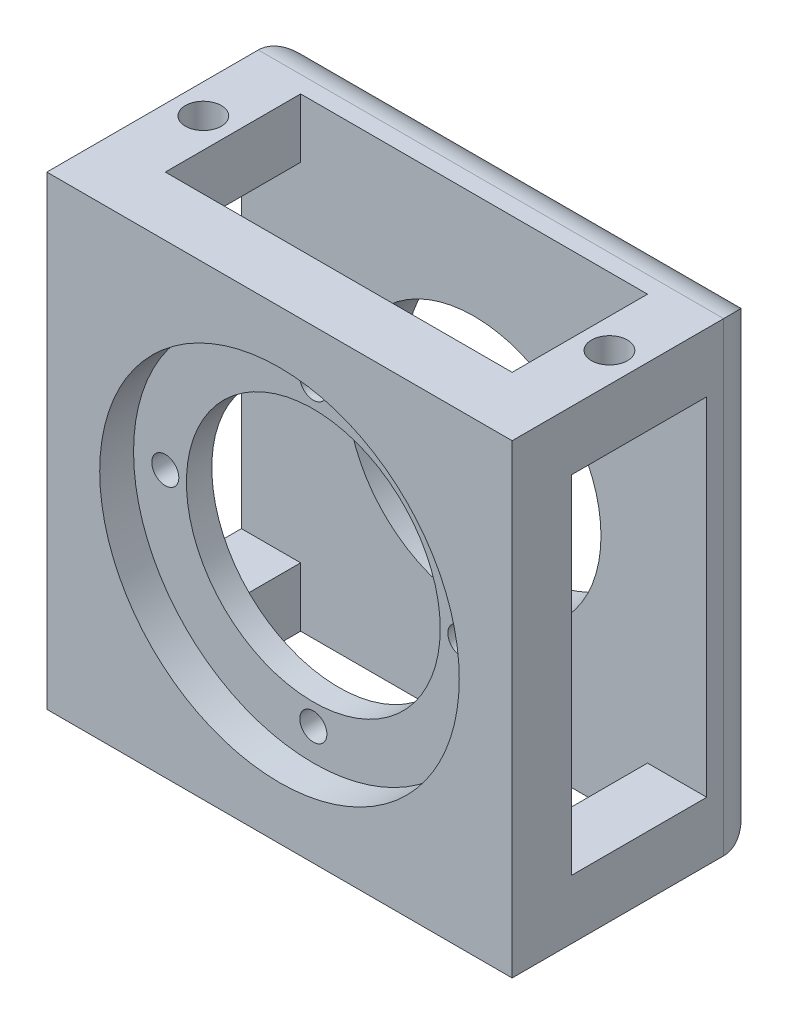
ISO-10303-21;
HEADER;
FILE_DESCRIPTION(('STEP AP214'),'2;1');
FILE_NAME('part.step','',(''),(''),'','','');
FILE_SCHEMA(('AUTOMOTIVE_DESIGN { 1 0 10303 214 1 1 1 1 }'));
ENDSEC;
DATA;
#1=APPLICATION_CONTEXT('core data for automotive mechanical design processes');
#2=APPLICATION_PROTOCOL_DEFINITION('international standard','automotive_design',2000,#1);
#3=PRODUCT_CONTEXT('',#1,'mechanical');
#4=PRODUCT('Part','Part','',(#3));
#5=PRODUCT_RELATED_PRODUCT_CATEGORY('part','',(#4));
#6=PRODUCT_DEFINITION_FORMATION('','',#4);
#7=PRODUCT_DEFINITION_CONTEXT('part definition',#1,'design');
#8=PRODUCT_DEFINITION('design','',#6,#7);
#9=PRODUCT_DEFINITION_SHAPE('','',#8);
#10=(LENGTH_UNIT() NAMED_UNIT(*) SI_UNIT(.MILLI.,.METRE.));
#11=(NAMED_UNIT(*) PLANE_ANGLE_UNIT() SI_UNIT($,.RADIAN.));
#12=(NAMED_UNIT(*) SI_UNIT($,.STERADIAN.) SOLID_ANGLE_UNIT());
#13=UNCERTAINTY_MEASURE_WITH_UNIT(LENGTH_MEASURE(1.E-05),#10,'distance_accuracy_value','');
#14=(GEOMETRIC_REPRESENTATION_CONTEXT(3) GLOBAL_UNCERTAINTY_ASSIGNED_CONTEXT((#13)) GLOBAL_UNIT_ASSIGNED_CONTEXT((#10,
#11,#12)) REPRESENTATION_CONTEXT('',''));
#15=CARTESIAN_POINT('',(0.,0.,0.));
#16=DIRECTION('',(0.,0.,1.));
#17=DIRECTION('',(1.,0.,0.));
#18=AXIS2_PLACEMENT_3D('',#15,#16,#17);
#19=CARTESIAN_POINT('',(-20.5,-27.5,7.));
#20=DIRECTION('',(-1.,0.,0.));
#21=DIRECTION('',(0.,0.,1.));
#22=AXIS2_PLACEMENT_3D('',#19,#20,#21);
#23=PLANE('',#22);
#24=DIRECTION('',(0.,1.,0.));
#25=VECTOR('',#24,1.);
#26=CARTESIAN_POINT('',(-20.5,-27.5,23.));
#27=LINE('',#26,#25);
#28=CARTESIAN_POINT('',(-20.5,20.5,23.));
#29=VERTEX_POINT('',#28);
#30=CARTESIAN_POINT('',(-20.5,27.5,23.));
#31=VERTEX_POINT('',#30);
#32=EDGE_CURVE('E268',#29,#31,#27,.T.);
#33=ORIENTED_EDGE('',*,*,#32,.F.);
#34=DIRECTION('',(0.,0.,-1.));
#35=VECTOR('',#34,1.);
#36=CARTESIAN_POINT('',(-20.5,20.5,7.));
#37=LINE('',#36,#35);
#38=CARTESIAN_POINT('',(-20.5,20.5,7.));
#39=VERTEX_POINT('',#38);
#40=EDGE_CURVE('E234',#29,#39,#37,.T.);
#41=ORIENTED_EDGE('',*,*,#40,.T.);
#42=DIRECTION('',(0.,1.,0.));
#43=VECTOR('',#42,1.);
#44=CARTESIAN_POINT('',(-20.5,-27.5,7.));
#45=LINE('',#44,#43);
#46=CARTESIAN_POINT('',(-20.5,27.5,7.));
#47=VERTEX_POINT('',#46);
#48=EDGE_CURVE('E288',#39,#47,#45,.T.);
#49=ORIENTED_EDGE('',*,*,#48,.T.);
#50=DIRECTION('',(0.,0.,1.));
#51=VECTOR('',#50,1.);
#52=CARTESIAN_POINT('',(-20.5,27.5,7.));
#53=LINE('',#52,#51);
#54=EDGE_CURVE('E250',#47,#31,#53,.T.);
#55=ORIENTED_EDGE('',*,*,#54,.T.);
#56=EDGE_LOOP('',(#33,#41,#49,#55));
#57=FACE_BOUND('',#56,.T.);
#58=ADVANCED_FACE('F45',(#57),#23,.F.);
#59=CARTESIAN_POINT('',(20.5,-27.5,7.));
#60=DIRECTION('',(1.,0.,0.));
#61=DIRECTION('',(0.,1.,0.));
#62=AXIS2_PLACEMENT_3D('',#59,#60,#61);
#63=PLANE('',#62);
#64=DIRECTION('',(0.,1.,0.));
#65=VECTOR('',#64,1.);
#66=CARTESIAN_POINT('',(20.5,-27.5,7.));
#67=LINE('',#66,#65);
#68=CARTESIAN_POINT('',(20.5,20.5,7.));
#69=VERTEX_POINT('',#68);
#70=CARTESIAN_POINT('',(20.5,27.5,7.));
#71=VERTEX_POINT('',#70);
#72=EDGE_CURVE('E291',#69,#71,#67,.T.);
#73=ORIENTED_EDGE('',*,*,#72,.F.);
#74=DIRECTION('',(0.,0.,1.));
#75=VECTOR('',#74,1.);
#76=CARTESIAN_POINT('',(20.5,20.5,7.));
#77=LINE('',#76,#75);
#78=CARTESIAN_POINT('',(20.5,20.5,23.));
#79=VERTEX_POINT('',#78);
#80=EDGE_CURVE('E230',#69,#79,#77,.T.);
#81=ORIENTED_EDGE('',*,*,#80,.T.);
#82=DIRECTION('',(0.,1.,0.));
#83=VECTOR('',#82,1.);
#84=CARTESIAN_POINT('',(20.5,-27.5,23.));
#85=LINE('',#84,#83);
#86=CARTESIAN_POINT('',(20.5,27.5,23.));
#87=VERTEX_POINT('',#86);
#88=EDGE_CURVE('E296',#79,#87,#85,.T.);
#89=ORIENTED_EDGE('',*,*,#88,.T.);
#90=DIRECTION('',(0.,0.,-1.));
#91=VECTOR('',#90,1.);
#92=CARTESIAN_POINT('',(20.5,27.5,7.));
#93=LINE('',#92,#91);
#94=EDGE_CURVE('E276',#87,#71,#93,.T.);
#95=ORIENTED_EDGE('',*,*,#94,.T.);
#96=EDGE_LOOP('',(#73,#81,#89,#95));
#97=FACE_BOUND('',#96,.T.);
#98=ADVANCED_FACE('F447',(#97),#63,.F.);
#99=CARTESIAN_POINT('',(-27.5,27.5,30.));
#100=DIRECTION('',(1.,0.,0.));
#101=DIRECTION('',(0.,1.,0.));
#102=AXIS2_PLACEMENT_3D('',#99,#100,#101);
#103=PLANE('',#102);
#104=DIRECTION('',(0.,0.,1.));
#105=VECTOR('',#104,1.);
#106=CARTESIAN_POINT('',(-27.5,20.5,30.));
#107=LINE('',#106,#105);
#108=CARTESIAN_POINT('',(-27.5,20.5,7.));
#109=VERTEX_POINT('',#108);
#110=CARTESIAN_POINT('',(-27.5,20.5,23.));
#111=VERTEX_POINT('',#110);
#112=EDGE_CURVE('E238',#109,#111,#107,.T.);
#113=ORIENTED_EDGE('',*,*,#112,.T.);
#114=DIRECTION('',(0.,-1.,0.));
#115=VECTOR('',#114,1.);
#116=CARTESIAN_POINT('',(-27.5,27.5,23.));
#117=LINE('',#116,#115);
#118=CARTESIAN_POINT('',(-27.5,-20.5,23.));
#119=VERTEX_POINT('',#118);
#120=EDGE_CURVE('E246',#111,#119,#117,.T.);
#121=ORIENTED_EDGE('',*,*,#120,.T.);
#122=DIRECTION('',(0.,0.,-1.));
#123=VECTOR('',#122,1.);
#124=CARTESIAN_POINT('',(-27.5,-20.5,30.));
#125=LINE('',#124,#123);
#126=CARTESIAN_POINT('',(-27.5,-20.5,7.));
#127=VERTEX_POINT('',#126);
#128=EDGE_CURVE('E226',#119,#127,#125,.T.);
#129=ORIENTED_EDGE('',*,*,#128,.T.);
#130=DIRECTION('',(0.,1.,0.));
#131=VECTOR('',#130,1.);
#132=CARTESIAN_POINT('',(-27.5,27.5,7.));
#133=LINE('',#132,#131);
#134=EDGE_CURVE('E242',#127,#109,#133,.T.);
#135=ORIENTED_EDGE('',*,*,#134,.T.);
#136=EDGE_LOOP('',(#113,#121,#129,#135));
#137=FACE_BOUND('',#136,.T.);
#138=DIRECTION('',(0.,0.,-1.));
#139=VECTOR('',#138,1.);
#140=CARTESIAN_POINT('',(-27.5,27.5,30.));
#141=LINE('',#140,#139);
#142=CARTESIAN_POINT('',(-27.5,27.5,30.));
#143=VERTEX_POINT('',#142);
#144=CARTESIAN_POINT('',(-27.5,27.5,5.));
#145=VERTEX_POINT('',#144);
#146=EDGE_CURVE('E313',#143,#145,#141,.T.);
#147=ORIENTED_EDGE('',*,*,#146,.T.);
#148=DIRECTION('',(0.,-1.,0.));
#149=VECTOR('',#148,1.);
#150=CARTESIAN_POINT('',(-27.5,27.5,5.));
#151=LINE('',#150,#149);
#152=CARTESIAN_POINT('',(-27.5,-27.5,5.));
#153=VERTEX_POINT('',#152);
#154=EDGE_CURVE('E11',#145,#153,#151,.T.);
#155=ORIENTED_EDGE('',*,*,#154,.T.);
#156=DIRECTION('',(0.,0.,-1.));
#157=VECTOR('',#156,1.);
#158=CARTESIAN_POINT('',(-27.5,-27.5,30.));
#159=LINE('',#158,#157);
#160=CARTESIAN_POINT('',(-27.5,-27.5,30.));
#161=VERTEX_POINT('',#160);
#162=EDGE_CURVE('E322',#161,#153,#159,.T.);
#163=ORIENTED_EDGE('',*,*,#162,.F.);
#164=DIRECTION('',(0.,-1.,0.));
#165=VECTOR('',#164,1.);
#166=CARTESIAN_POINT('',(-27.5,27.5,30.));
#167=LINE('',#166,#165);
#168=EDGE_CURVE('E287',#143,#161,#167,.T.);
#169=ORIENTED_EDGE('',*,*,#168,.F.);
#170=EDGE_LOOP('',(#147,#155,#163,#169));
#171=FACE_BOUND('',#170,.T.);
#172=ADVANCED_FACE('F474',(#137,#171),#103,.F.);
#173=CARTESIAN_POINT('',(-27.5,-27.5,30.));
#174=DIRECTION('',(0.,1.,0.));
#175=DIRECTION('',(-1.,0.,0.));
#176=AXIS2_PLACEMENT_3D('',#173,#174,#175);
#177=PLANE('',#176);
#178=DIRECTION('',(-1.,0.,0.));
#179=VECTOR('',#178,1.);
#180=CARTESIAN_POINT('',(-20.5,-27.5,7.));
#181=LINE('',#180,#179);
#182=CARTESIAN_POINT('',(20.5,-27.5,7.));
#183=VERTEX_POINT('',#182);
#184=CARTESIAN_POINT('',(-20.5,-27.5,7.));
#185=VERTEX_POINT('',#184);
#186=EDGE_CURVE('E264',#183,#185,#181,.T.);
#187=ORIENTED_EDGE('',*,*,#186,.T.);
#188=DIRECTION('',(0.,0.,1.));
#189=VECTOR('',#188,1.);
#190=CARTESIAN_POINT('',(-20.5,-27.5,7.));
#191=LINE('',#190,#189);
#192=CARTESIAN_POINT('',(-20.5,-27.5,23.));
#193=VERTEX_POINT('',#192);
#194=EDGE_CURVE('E251',#185,#193,#191,.T.);
#195=ORIENTED_EDGE('',*,*,#194,.T.);
#196=DIRECTION('',(1.,0.,0.));
#197=VECTOR('',#196,1.);
#198=CARTESIAN_POINT('',(-20.5,-27.5,23.));
#199=LINE('',#198,#197);
#200=CARTESIAN_POINT('',(20.5,-27.5,23.));
#201=VERTEX_POINT('',#200);
#202=EDGE_CURVE('E255',#193,#201,#199,.T.);
#203=ORIENTED_EDGE('',*,*,#202,.T.);
#204=DIRECTION('',(0.,0.,-1.));
#205=VECTOR('',#204,1.);
#206=CARTESIAN_POINT('',(20.5,-27.5,7.));
#207=LINE('',#206,#205);
#208=EDGE_CURVE('E260',#201,#183,#207,.T.);
#209=ORIENTED_EDGE('',*,*,#208,.T.);
#210=EDGE_LOOP('',(#187,#195,#203,#209));
#211=FACE_BOUND('',#210,.T.);
#212=ORIENTED_EDGE('',*,*,#162,.T.);
#213=DIRECTION('',(1.,0.,0.));
#214=VECTOR('',#213,1.);
#215=CARTESIAN_POINT('',(-27.5,-27.5,5.));
#216=LINE('',#215,#214);
#217=CARTESIAN_POINT('',(27.5,-27.5,5.));
#218=VERTEX_POINT('',#217);
#219=EDGE_CURVE('E326',#153,#218,#216,.T.);
#220=ORIENTED_EDGE('',*,*,#219,.T.);
#221=DIRECTION('',(0.,0.,-1.));
#222=VECTOR('',#221,1.);
#223=CARTESIAN_POINT('',(27.5,-27.5,30.));
#224=LINE('',#223,#222);
#225=CARTESIAN_POINT('',(27.5,-27.5,30.));
#226=VERTEX_POINT('',#225);
#227=EDGE_CURVE('E319',#226,#218,#224,.T.);
#228=ORIENTED_EDGE('',*,*,#227,.F.);
#229=DIRECTION('',(1.,0.,0.));
#230=VECTOR('',#229,1.);
#231=CARTESIAN_POINT('',(-27.5,-27.5,30.));
#232=LINE('',#231,#230);
#233=EDGE_CURVE('E304',#161,#226,#232,.T.);
#234=ORIENTED_EDGE('',*,*,#233,.F.);
#235=EDGE_LOOP('',(#212,#220,#228,#234));
#236=FACE_BOUND('',#235,.T.);
#237=ADVANCED_FACE('F468',(#211,#236),#177,.F.);
#238=CARTESIAN_POINT('',(27.5,27.5,30.));
#239=DIRECTION('',(-1.,0.,0.));
#240=DIRECTION('',(0.,-1.,0.));
#241=AXIS2_PLACEMENT_3D('',#238,#239,#240);
#242=PLANE('',#241);
#243=DIRECTION('',(0.,0.,-1.));
#244=VECTOR('',#243,1.);
#245=CARTESIAN_POINT('',(27.5,-20.5,23.));
#246=LINE('',#245,#244);
#247=CARTESIAN_POINT('',(27.5,-20.5,23.));
#248=VERTEX_POINT('',#247);
#249=CARTESIAN_POINT('',(27.5,-20.5,6.99999999999999));
#250=VERTEX_POINT('',#249);
#251=EDGE_CURVE('E191',#248,#250,#246,.T.);
#252=ORIENTED_EDGE('',*,*,#251,.F.);
#253=DIRECTION('',(0.,-1.,0.));
#254=VECTOR('',#253,1.);
#255=CARTESIAN_POINT('',(27.5,20.5,23.));
#256=LINE('',#255,#254);
#257=CARTESIAN_POINT('',(27.5,20.5,23.));
#258=VERTEX_POINT('',#257);
#259=EDGE_CURVE('E198',#258,#248,#256,.T.);
#260=ORIENTED_EDGE('',*,*,#259,.F.);
#261=DIRECTION('',(0.,0.,1.));
#262=VECTOR('',#261,1.);
#263=CARTESIAN_POINT('',(27.5,20.5,23.));
#264=LINE('',#263,#262);
#265=CARTESIAN_POINT('',(27.5,20.5,7.));
#266=VERTEX_POINT('',#265);
#267=EDGE_CURVE('E202',#266,#258,#264,.T.);
#268=ORIENTED_EDGE('',*,*,#267,.F.);
#269=DIRECTION('',(0.,1.,0.));
#270=VECTOR('',#269,1.);
#271=CARTESIAN_POINT('',(27.5,20.5,7.));
#272=LINE('',#271,#270);
#273=EDGE_CURVE('E179',#250,#266,#272,.T.);
#274=ORIENTED_EDGE('',*,*,#273,.F.);
#275=EDGE_LOOP('',(#252,#260,#268,#274));
#276=FACE_BOUND('',#275,.T.);
#277=ORIENTED_EDGE('',*,*,#227,.T.);
#278=DIRECTION('',(0.,1.,0.));
#279=VECTOR('',#278,1.);
#280=CARTESIAN_POINT('',(27.5,27.5,5.));
#281=LINE('',#280,#279);
#282=CARTESIAN_POINT('',(27.5,27.5,5.));
#283=VERTEX_POINT('',#282);
#284=EDGE_CURVE('E55',#218,#283,#281,.T.);
#285=ORIENTED_EDGE('',*,*,#284,.T.);
#286=DIRECTION('',(0.,0.,-1.));
#287=VECTOR('',#286,1.);
#288=CARTESIAN_POINT('',(27.5,27.5,30.));
#289=LINE('',#288,#287);
#290=CARTESIAN_POINT('',(27.5,27.5,30.));
#291=VERTEX_POINT('',#290);
#292=EDGE_CURVE('E316',#291,#283,#289,.T.);
#293=ORIENTED_EDGE('',*,*,#292,.F.);
#294=DIRECTION('',(0.,1.,0.));
#295=VECTOR('',#294,1.);
#296=CARTESIAN_POINT('',(27.5,27.5,30.));
#297=LINE('',#296,#295);
#298=EDGE_CURVE('E307',#226,#291,#297,.T.);
#299=ORIENTED_EDGE('',*,*,#298,.F.);
#300=EDGE_LOOP('',(#277,#285,#293,#299));
#301=FACE_BOUND('',#300,.T.);
#302=ADVANCED_FACE('F200',(#276,#301),#242,.F.);
#303=CARTESIAN_POINT('',(-27.5,27.5,30.));
#304=DIRECTION('',(0.,-1.,0.));
#305=DIRECTION('',(1.,0.,0.));
#306=AXIS2_PLACEMENT_3D('',#303,#304,#305);
#307=PLANE('',#306);
#308=CARTESIAN_POINT('',(-24.,27.5,15.));
#309=DIRECTION('',(0.,1.,0.));
#310=DIRECTION('',(-1.,0.,0.));
#311=AXIS2_PLACEMENT_3D('',#308,#309,#310);
#312=CIRCLE('',#311,2.125);
#313=CARTESIAN_POINT('',(-26.125,27.5,15.));
#314=VERTEX_POINT('',#313);
#315=EDGE_CURVE('E338',#314,#314,#312,.T.);
#316=ORIENTED_EDGE('',*,*,#315,.F.);
#317=EDGE_LOOP('',(#316));
#318=FACE_BOUND('',#317,.T.);
#319=CARTESIAN_POINT('',(24.,27.5,15.));
#320=DIRECTION('',(0.,1.,0.));
#321=DIRECTION('',(-1.,0.,0.));
#322=AXIS2_PLACEMENT_3D('',#319,#320,#321);
#323=CIRCLE('',#322,2.125);
#324=CARTESIAN_POINT('',(21.875,27.5,15.));
#325=VERTEX_POINT('',#324);
#326=EDGE_CURVE('E376',#325,#325,#323,.T.);
#327=ORIENTED_EDGE('',*,*,#326,.F.);
#328=EDGE_LOOP('',(#327));
#329=FACE_BOUND('',#328,.T.);
#330=DIRECTION('',(1.,0.,0.));
#331=VECTOR('',#330,1.);
#332=CARTESIAN_POINT('',(-20.5,27.5,23.));
#333=LINE('',#332,#331);
#334=EDGE_CURVE('E272',#31,#87,#333,.T.);
#335=ORIENTED_EDGE('',*,*,#334,.F.);
#336=ORIENTED_EDGE('',*,*,#54,.F.);
#337=DIRECTION('',(-1.,0.,0.));
#338=VECTOR('',#337,1.);
#339=CARTESIAN_POINT('',(-20.5,27.5,7.));
#340=LINE('',#339,#338);
#341=EDGE_CURVE('E256',#71,#47,#340,.T.);
#342=ORIENTED_EDGE('',*,*,#341,.F.);
#343=ORIENTED_EDGE('',*,*,#94,.F.);
#344=EDGE_LOOP('',(#335,#336,#342,#343));
#345=FACE_BOUND('',#344,.T.);
#346=ORIENTED_EDGE('',*,*,#292,.T.);
#347=DIRECTION('',(-1.,0.,0.));
#348=VECTOR('',#347,1.);
#349=CARTESIAN_POINT('',(-27.5,27.5,5.));
#350=LINE('',#349,#348);
#351=EDGE_CURVE('E69',#283,#145,#350,.T.);
#352=ORIENTED_EDGE('',*,*,#351,.T.);
#353=ORIENTED_EDGE('',*,*,#146,.F.);
#354=DIRECTION('',(-1.,0.,0.));
#355=VECTOR('',#354,1.);
#356=CARTESIAN_POINT('',(-27.5,27.5,30.));
#357=LINE('',#356,#355);
#358=EDGE_CURVE('E310',#291,#143,#357,.T.);
#359=ORIENTED_EDGE('',*,*,#358,.F.);
#360=EDGE_LOOP('',(#346,#352,#353,#359));
#361=FACE_BOUND('',#360,.T.);
#362=ADVANCED_FACE('F484',(#318,#329,#345,#361),#307,.F.);
#363=CARTESIAN_POINT('',(0.,0.,30.));
#364=DIRECTION('',(0.,0.,1.));
#365=DIRECTION('',(1.,0.,0.));
#366=AXIS2_PLACEMENT_3D('',#363,#364,#365);
#367=PLANE('',#366);
#368=CARTESIAN_POINT('',(0.,0.,30.));
#369=DIRECTION('',(0.,0.,1.));
#370=DIRECTION('',(1.,0.,0.));
#371=AXIS2_PLACEMENT_3D('',#368,#369,#370);
#372=CIRCLE('',#371,21.25);
#373=CARTESIAN_POINT('',(21.25,0.,30.));
#374=VERTEX_POINT('',#373);
#375=EDGE_CURVE('E431',#374,#374,#372,.T.);
#376=ORIENTED_EDGE('',*,*,#375,.F.);
#377=EDGE_LOOP('',(#376));
#378=FACE_BOUND('',#377,.T.);
#379=ORIENTED_EDGE('',*,*,#168,.T.);
#380=ORIENTED_EDGE('',*,*,#233,.T.);
#381=ORIENTED_EDGE('',*,*,#298,.T.);
#382=ORIENTED_EDGE('',*,*,#358,.T.);
#383=EDGE_LOOP('',(#379,#380,#381,#382));
#384=FACE_BOUND('',#383,.T.);
#385=ADVANCED_FACE('F486',(#378,#384),#367,.T.);
#386=CARTESIAN_POINT('',(0.,0.,0.));
#387=DIRECTION('',(0.,0.,1.));
#388=DIRECTION('',(1.,0.,0.));
#389=AXIS2_PLACEMENT_3D('',#386,#387,#388);
#390=PLANE('',#389);
#391=DIRECTION('',(-1.,0.,0.));
#392=VECTOR('',#391,1.);
#393=CARTESIAN_POINT('',(0.,22.5,0.));
#394=LINE('',#393,#392);
#395=CARTESIAN_POINT('',(-22.5,22.5,0.));
#396=VERTEX_POINT('',#395);
#397=CARTESIAN_POINT('',(22.5,22.5,0.));
#398=VERTEX_POINT('',#397);
#399=EDGE_CURVE('E349',#396,#398,#394,.F.);
#400=ORIENTED_EDGE('',*,*,#399,.T.);
#401=DIRECTION('',(0.,1.,0.));
#402=VECTOR('',#401,1.);
#403=CARTESIAN_POINT('',(22.5,0.,0.));
#404=LINE('',#403,#402);
#405=CARTESIAN_POINT('',(22.5,-22.5,0.));
#406=VERTEX_POINT('',#405);
#407=EDGE_CURVE('E356',#398,#406,#404,.F.);
#408=ORIENTED_EDGE('',*,*,#407,.T.);
#409=DIRECTION('',(1.,0.,0.));
#410=VECTOR('',#409,1.);
#411=CARTESIAN_POINT('',(0.,-22.5,0.));
#412=LINE('',#411,#410);
#413=CARTESIAN_POINT('',(-22.5,-22.5,0.));
#414=VERTEX_POINT('',#413);
#415=EDGE_CURVE('E352',#406,#414,#412,.F.);
#416=ORIENTED_EDGE('',*,*,#415,.T.);
#417=DIRECTION('',(0.,-1.,0.));
#418=VECTOR('',#417,1.);
#419=CARTESIAN_POINT('',(-22.5,0.,0.));
#420=LINE('',#419,#418);
#421=EDGE_CURVE('E346',#414,#396,#420,.F.);
#422=ORIENTED_EDGE('',*,*,#421,.T.);
#423=EDGE_LOOP('',(#400,#408,#416,#422));
#424=FACE_BOUND('',#423,.T.);
#425=CARTESIAN_POINT('',(0.,0.,0.));
#426=DIRECTION('',(0.,0.,1.));
#427=DIRECTION('',(1.,0.,0.));
#428=AXIS2_PLACEMENT_3D('',#425,#426,#427);
#429=CIRCLE('',#428,15.);
#430=CARTESIAN_POINT('',(15.,0.,0.));
#431=VERTEX_POINT('',#430);
#432=EDGE_CURVE('E427',#431,#431,#429,.T.);
#433=ORIENTED_EDGE('',*,*,#432,.T.);
#434=EDGE_LOOP('',(#433));
#435=FACE_BOUND('',#434,.T.);
#436=ADVANCED_FACE('F516',(#424,#435),#390,.F.);
#437=CARTESIAN_POINT('',(-20.5,-20.5,6.99999999999999));
#438=VERTEX_POINT('',#437);
#439=EDGE_CURVE('E283',#185,#438,#45,.T.);
#440=ORIENTED_EDGE('',*,*,#439,.T.);
#441=DIRECTION('',(0.,0.,1.));
#442=VECTOR('',#441,1.);
#443=CARTESIAN_POINT('',(-20.5,-20.5,7.));
#444=LINE('',#443,#442);
#445=CARTESIAN_POINT('',(-20.5,-20.5,23.));
#446=VERTEX_POINT('',#445);
#447=EDGE_CURVE('E222',#438,#446,#444,.T.);
#448=ORIENTED_EDGE('',*,*,#447,.T.);
#449=EDGE_CURVE('E297',#193,#446,#27,.T.);
#450=ORIENTED_EDGE('',*,*,#449,.F.);
#451=ORIENTED_EDGE('',*,*,#194,.F.);
#452=EDGE_LOOP('',(#440,#448,#450,#451));
#453=FACE_BOUND('',#452,.T.);
#454=ADVANCED_FACE('F464',(#453),#23,.F.);
#455=CARTESIAN_POINT('',(-20.5,-27.5,7.));
#456=DIRECTION('',(0.,0.,-1.));
#457=DIRECTION('',(-1.,0.,0.));
#458=AXIS2_PLACEMENT_3D('',#455,#456,#457);
#459=PLANE('',#458);
#460=CARTESIAN_POINT('',(0.,0.,7.));
#461=DIRECTION('',(0.,0.,-1.));
#462=DIRECTION('',(-1.,0.,0.));
#463=AXIS2_PLACEMENT_3D('',#460,#461,#462);
#464=CIRCLE('',#463,15.);
#465=CARTESIAN_POINT('',(-15.,0.,7.));
#466=VERTEX_POINT('',#465);
#467=EDGE_CURVE('E331',#466,#466,#464,.T.);
#468=ORIENTED_EDGE('',*,*,#467,.T.);
#469=EDGE_LOOP('',(#468));
#470=FACE_BOUND('',#469,.T.);
#471=CARTESIAN_POINT('',(20.5,-20.5,7.));
#472=VERTEX_POINT('',#471);
#473=EDGE_CURVE('E182',#183,#472,#67,.T.);
#474=ORIENTED_EDGE('',*,*,#473,.T.);
#475=DIRECTION('',(1.,0.,0.));
#476=VECTOR('',#475,1.);
#477=CARTESIAN_POINT('',(-32.5,-20.5,6.99999999999999));
#478=LINE('',#477,#476);
#479=EDGE_CURVE('E174',#472,#250,#478,.T.);
#480=ORIENTED_EDGE('',*,*,#479,.T.);
#481=ORIENTED_EDGE('',*,*,#273,.T.);
#482=DIRECTION('',(1.,0.,0.));
#483=VECTOR('',#482,1.);
#484=CARTESIAN_POINT('',(-32.5,20.5,7.));
#485=LINE('',#484,#483);
#486=EDGE_CURVE('E214',#69,#266,#485,.T.);
#487=ORIENTED_EDGE('',*,*,#486,.F.);
#488=ORIENTED_EDGE('',*,*,#72,.T.);
#489=ORIENTED_EDGE('',*,*,#341,.T.);
#490=ORIENTED_EDGE('',*,*,#48,.F.);
#491=EDGE_CURVE('E213',#109,#39,#485,.T.);
#492=ORIENTED_EDGE('',*,*,#491,.F.);
#493=ORIENTED_EDGE('',*,*,#134,.F.);
#494=EDGE_CURVE('E186',#127,#438,#478,.T.);
#495=ORIENTED_EDGE('',*,*,#494,.T.);
#496=ORIENTED_EDGE('',*,*,#439,.F.);
#497=ORIENTED_EDGE('',*,*,#186,.F.);
#498=EDGE_LOOP('',(#474,#480,#481,#487,#488,#489,#490,#492,#493,#495,#496,#497));
#499=FACE_BOUND('',#498,.T.);
#500=ADVANCED_FACE('F176',(#470,#499),#459,.F.);
#501=CARTESIAN_POINT('',(20.5,-20.5,23.));
#502=VERTEX_POINT('',#501);
#503=EDGE_CURVE('E292',#201,#502,#85,.T.);
#504=ORIENTED_EDGE('',*,*,#503,.T.);
#505=DIRECTION('',(0.,0.,-1.));
#506=VECTOR('',#505,1.);
#507=CARTESIAN_POINT('',(20.5,-20.5,7.));
#508=LINE('',#507,#506);
#509=EDGE_CURVE('E219',#502,#472,#508,.T.);
#510=ORIENTED_EDGE('',*,*,#509,.T.);
#511=ORIENTED_EDGE('',*,*,#473,.F.);
#512=ORIENTED_EDGE('',*,*,#208,.F.);
#513=EDGE_LOOP('',(#504,#510,#511,#512));
#514=FACE_BOUND('',#513,.T.);
#515=ADVANCED_FACE('F512',(#514),#63,.F.);
#516=CARTESIAN_POINT('',(-20.5,-27.5,23.));
#517=DIRECTION('',(0.,0.,1.));
#518=DIRECTION('',(1.,0.,0.));
#519=AXIS2_PLACEMENT_3D('',#516,#517,#518);
#520=PLANE('',#519);
#521=CARTESIAN_POINT('',(0.,17.5,23.));
#522=DIRECTION('',(0.,0.,1.));
#523=DIRECTION('',(1.,0.,0.));
#524=AXIS2_PLACEMENT_3D('',#521,#522,#523);
#525=CIRCLE('',#524,1.6);
#526=CARTESIAN_POINT('',(1.6,17.5,23.));
#527=VERTEX_POINT('',#526);
#528=EDGE_CURVE('E417',#527,#527,#525,.T.);
#529=ORIENTED_EDGE('',*,*,#528,.T.);
#530=EDGE_LOOP('',(#529));
#531=FACE_BOUND('',#530,.T.);
#532=CARTESIAN_POINT('',(17.5,0.,23.));
#533=DIRECTION('',(0.,0.,1.));
#534=DIRECTION('',(1.,0.,0.));
#535=AXIS2_PLACEMENT_3D('',#532,#533,#534);
#536=CIRCLE('',#535,1.6);
#537=CARTESIAN_POINT('',(19.1,0.,23.));
#538=VERTEX_POINT('',#537);
#539=EDGE_CURVE('E413',#538,#538,#536,.T.);
#540=ORIENTED_EDGE('',*,*,#539,.T.);
#541=EDGE_LOOP('',(#540));
#542=FACE_BOUND('',#541,.T.);
#543=CARTESIAN_POINT('',(-1.2220184685951E-13,-17.5,23.));
#544=DIRECTION('',(0.,0.,1.));
#545=DIRECTION('',(1.,0.,0.));
#546=AXIS2_PLACEMENT_3D('',#543,#544,#545);
#547=CIRCLE('',#546,1.6);
#548=CARTESIAN_POINT('',(1.59999999999988,-17.5,23.));
#549=VERTEX_POINT('',#548);
#550=EDGE_CURVE('E409',#549,#549,#547,.T.);
#551=ORIENTED_EDGE('',*,*,#550,.T.);
#552=EDGE_LOOP('',(#551));
#553=FACE_BOUND('',#552,.T.);
#554=CARTESIAN_POINT('',(-17.5,1.83302770289265E-13,23.));
#555=DIRECTION('',(0.,0.,1.));
#556=DIRECTION('',(1.,0.,0.));
#557=AXIS2_PLACEMENT_3D('',#554,#555,#556);
#558=CIRCLE('',#557,1.6);
#559=CARTESIAN_POINT('',(-15.9,1.83302770289265E-13,23.));
#560=VERTEX_POINT('',#559);
#561=EDGE_CURVE('E394',#560,#560,#558,.T.);
#562=ORIENTED_EDGE('',*,*,#561,.T.);
#563=EDGE_LOOP('',(#562));
#564=FACE_BOUND('',#563,.T.);
#565=CARTESIAN_POINT('',(0.,0.,23.));
#566=DIRECTION('',(0.,0.,1.));
#567=DIRECTION('',(1.,0.,0.));
#568=AXIS2_PLACEMENT_3D('',#565,#566,#567);
#569=CIRCLE('',#568,15.);
#570=CARTESIAN_POINT('',(15.,0.,23.));
#571=VERTEX_POINT('',#570);
#572=EDGE_CURVE('E327',#571,#571,#569,.T.);
#573=ORIENTED_EDGE('',*,*,#572,.T.);
#574=EDGE_LOOP('',(#573));
#575=FACE_BOUND('',#574,.T.);
#576=ORIENTED_EDGE('',*,*,#449,.T.);
#577=DIRECTION('',(1.,0.,0.));
#578=VECTOR('',#577,1.);
#579=CARTESIAN_POINT('',(-32.5,-20.5,23.));
#580=LINE('',#579,#578);
#581=EDGE_CURVE('E187',#119,#446,#580,.T.);
#582=ORIENTED_EDGE('',*,*,#581,.F.);
#583=ORIENTED_EDGE('',*,*,#120,.F.);
#584=DIRECTION('',(1.,0.,0.));
#585=VECTOR('',#584,1.);
#586=CARTESIAN_POINT('',(-32.5,20.5,23.));
#587=LINE('',#586,#585);
#588=EDGE_CURVE('E212',#111,#29,#587,.T.);
#589=ORIENTED_EDGE('',*,*,#588,.T.);
#590=ORIENTED_EDGE('',*,*,#32,.T.);
#591=ORIENTED_EDGE('',*,*,#334,.T.);
#592=ORIENTED_EDGE('',*,*,#88,.F.);
#593=EDGE_CURVE('E209',#79,#258,#587,.T.);
#594=ORIENTED_EDGE('',*,*,#593,.T.);
#595=ORIENTED_EDGE('',*,*,#259,.T.);
#596=EDGE_CURVE('E194',#502,#248,#580,.T.);
#597=ORIENTED_EDGE('',*,*,#596,.F.);
#598=ORIENTED_EDGE('',*,*,#503,.F.);
#599=ORIENTED_EDGE('',*,*,#202,.F.);
#600=EDGE_LOOP('',(#576,#582,#583,#589,#590,#591,#592,#594,#595,#597,#598,#599));
#601=FACE_BOUND('',#600,.T.);
#602=ADVANCED_FACE('F440',(#531,#542,#553,#564,#575,#601),#520,.F.);
#603=CARTESIAN_POINT('',(-32.5,-20.5,23.));
#604=DIRECTION('',(0.,-1.,0.));
#605=DIRECTION('',(1.,0.,0.));
#606=AXIS2_PLACEMENT_3D('',#603,#604,#605);
#607=PLANE('',#606);
#608=ORIENTED_EDGE('',*,*,#596,.T.);
#609=ORIENTED_EDGE('',*,*,#251,.T.);
#610=ORIENTED_EDGE('',*,*,#479,.F.);
#611=ORIENTED_EDGE('',*,*,#509,.F.);
#612=EDGE_LOOP('',(#608,#609,#610,#611));
#613=FACE_BOUND('',#612,.T.);
#614=ADVANCED_FACE('F192',(#613),#607,.F.);
#615=CARTESIAN_POINT('',(-32.5,20.5,23.));
#616=DIRECTION('',(0.,1.,0.));
#617=DIRECTION('',(-1.,0.,0.));
#618=AXIS2_PLACEMENT_3D('',#615,#616,#617);
#619=PLANE('',#618);
#620=CARTESIAN_POINT('',(24.,20.5,15.));
#621=DIRECTION('',(0.,1.,0.));
#622=DIRECTION('',(-1.,0.,0.));
#623=AXIS2_PLACEMENT_3D('',#620,#621,#622);
#624=CIRCLE('',#623,2.125);
#625=CARTESIAN_POINT('',(21.875,20.5,15.));
#626=VERTEX_POINT('',#625);
#627=EDGE_CURVE('E337',#626,#626,#624,.T.);
#628=ORIENTED_EDGE('',*,*,#627,.T.);
#629=EDGE_LOOP('',(#628));
#630=FACE_BOUND('',#629,.T.);
#631=ORIENTED_EDGE('',*,*,#486,.T.);
#632=ORIENTED_EDGE('',*,*,#267,.T.);
#633=ORIENTED_EDGE('',*,*,#593,.F.);
#634=ORIENTED_EDGE('',*,*,#80,.F.);
#635=EDGE_LOOP('',(#631,#632,#633,#634));
#636=FACE_BOUND('',#635,.T.);
#637=ADVANCED_FACE('F444',(#630,#636),#619,.F.);
#638=CARTESIAN_POINT('',(-24.,20.5,15.));
#639=DIRECTION('',(0.,1.,0.));
#640=DIRECTION('',(-1.,0.,0.));
#641=AXIS2_PLACEMENT_3D('',#638,#639,#640);
#642=CIRCLE('',#641,2.125);
#643=CARTESIAN_POINT('',(-26.125,20.5,15.));
#644=VERTEX_POINT('',#643);
#645=EDGE_CURVE('E333',#644,#644,#642,.T.);
#646=ORIENTED_EDGE('',*,*,#645,.T.);
#647=EDGE_LOOP('',(#646));
#648=FACE_BOUND('',#647,.T.);
#649=ORIENTED_EDGE('',*,*,#491,.T.);
#650=ORIENTED_EDGE('',*,*,#40,.F.);
#651=ORIENTED_EDGE('',*,*,#588,.F.);
#652=ORIENTED_EDGE('',*,*,#112,.F.);
#653=EDGE_LOOP('',(#649,#650,#651,#652));
#654=FACE_BOUND('',#653,.T.);
#655=ADVANCED_FACE('F479',(#648,#654),#619,.F.);
#656=ORIENTED_EDGE('',*,*,#581,.T.);
#657=ORIENTED_EDGE('',*,*,#447,.F.);
#658=ORIENTED_EDGE('',*,*,#494,.F.);
#659=ORIENTED_EDGE('',*,*,#128,.F.);
#660=EDGE_LOOP('',(#656,#657,#658,#659));
#661=FACE_BOUND('',#660,.T.);
#662=ADVANCED_FACE('F462',(#661),#607,.F.);
#663=CARTESIAN_POINT('',(0.,0.,26.));
#664=DIRECTION('',(0.,0.,1.));
#665=DIRECTION('',(1.,0.,0.));
#666=AXIS2_PLACEMENT_3D('',#663,#664,#665);
#667=CYLINDRICAL_SURFACE('',#666,21.25);
#668=CARTESIAN_POINT('',(0.,0.,26.));
#669=DIRECTION('',(0.,0.,1.));
#670=DIRECTION('',(1.,0.,0.));
#671=AXIS2_PLACEMENT_3D('',#668,#669,#670);
#672=CIRCLE('',#671,21.25);
#673=CARTESIAN_POINT('',(21.25,0.,26.));
#674=VERTEX_POINT('',#673);
#675=EDGE_CURVE('E432',#674,#674,#672,.T.);
#676=ORIENTED_EDGE('',*,*,#675,.F.);
#677=EDGE_LOOP('',(#676));
#678=FACE_BOUND('',#677,.T.);
#679=ORIENTED_EDGE('',*,*,#375,.T.);
#680=EDGE_LOOP('',(#679));
#681=FACE_BOUND('',#680,.T.);
#682=ADVANCED_FACE('F555',(#678,#681),#667,.F.);
#683=CARTESIAN_POINT('',(0.,0.,26.));
#684=DIRECTION('',(0.,0.,1.));
#685=DIRECTION('',(1.,0.,0.));
#686=AXIS2_PLACEMENT_3D('',#683,#684,#685);
#687=PLANE('',#686);
#688=CARTESIAN_POINT('',(0.,17.5,26.));
#689=DIRECTION('',(0.,0.,1.));
#690=DIRECTION('',(1.,0.,0.));
#691=AXIS2_PLACEMENT_3D('',#688,#689,#690);
#692=CIRCLE('',#691,1.6);
#693=CARTESIAN_POINT('',(1.6,17.5,26.));
#694=VERTEX_POINT('',#693);
#695=EDGE_CURVE('E390',#694,#694,#692,.T.);
#696=ORIENTED_EDGE('',*,*,#695,.F.);
#697=EDGE_LOOP('',(#696));
#698=FACE_BOUND('',#697,.T.);
#699=CARTESIAN_POINT('',(17.5,0.,26.));
#700=DIRECTION('',(0.,0.,1.));
#701=DIRECTION('',(1.,0.,0.));
#702=AXIS2_PLACEMENT_3D('',#699,#700,#701);
#703=CIRCLE('',#702,1.6);
#704=CARTESIAN_POINT('',(19.1,0.,26.));
#705=VERTEX_POINT('',#704);
#706=EDGE_CURVE('E395',#705,#705,#703,.T.);
#707=ORIENTED_EDGE('',*,*,#706,.F.);
#708=EDGE_LOOP('',(#707));
#709=FACE_BOUND('',#708,.T.);
#710=CARTESIAN_POINT('',(-1.2220184685951E-13,-17.5,26.));
#711=DIRECTION('',(0.,0.,1.));
#712=DIRECTION('',(1.,0.,0.));
#713=AXIS2_PLACEMENT_3D('',#710,#711,#712);
#714=CIRCLE('',#713,1.6);
#715=CARTESIAN_POINT('',(1.59999999999988,-17.5,26.));
#716=VERTEX_POINT('',#715);
#717=EDGE_CURVE('E399',#716,#716,#714,.T.);
#718=ORIENTED_EDGE('',*,*,#717,.F.);
#719=EDGE_LOOP('',(#718));
#720=FACE_BOUND('',#719,.T.);
#721=CARTESIAN_POINT('',(-17.5,1.83302770289265E-13,26.));
#722=DIRECTION('',(0.,0.,1.));
#723=DIRECTION('',(1.,0.,0.));
#724=AXIS2_PLACEMENT_3D('',#721,#722,#723);
#725=CIRCLE('',#724,1.6);
#726=CARTESIAN_POINT('',(-15.9,1.83302770289265E-13,26.));
#727=VERTEX_POINT('',#726);
#728=EDGE_CURVE('E342',#727,#727,#725,.T.);
#729=ORIENTED_EDGE('',*,*,#728,.F.);
#730=EDGE_LOOP('',(#729));
#731=FACE_BOUND('',#730,.T.);
#732=CARTESIAN_POINT('',(0.,0.,26.));
#733=DIRECTION('',(0.,0.,1.));
#734=DIRECTION('',(1.,0.,0.));
#735=AXIS2_PLACEMENT_3D('',#732,#733,#734);
#736=CIRCLE('',#735,15.);
#737=CARTESIAN_POINT('',(15.,0.,26.));
#738=VERTEX_POINT('',#737);
#739=EDGE_CURVE('E332',#738,#738,#736,.T.);
#740=ORIENTED_EDGE('',*,*,#739,.F.);
#741=EDGE_LOOP('',(#740));
#742=FACE_BOUND('',#741,.T.);
#743=ORIENTED_EDGE('',*,*,#675,.T.);
#744=EDGE_LOOP('',(#743));
#745=FACE_BOUND('',#744,.T.);
#746=ADVANCED_FACE('F548',(#698,#709,#720,#731,#742,#745),#687,.T.);
#747=CARTESIAN_POINT('',(0.,0.,-24.));
#748=DIRECTION('',(0.,0.,1.));
#749=DIRECTION('',(1.,0.,0.));
#750=AXIS2_PLACEMENT_3D('',#747,#748,#749);
#751=CYLINDRICAL_SURFACE('',#750,15.);
#752=ORIENTED_EDGE('',*,*,#739,.T.);
#753=EDGE_LOOP('',(#752));
#754=FACE_BOUND('',#753,.T.);
#755=ORIENTED_EDGE('',*,*,#572,.F.);
#756=EDGE_LOOP('',(#755));
#757=FACE_BOUND('',#756,.T.);
#758=ADVANCED_FACE('F537',(#754,#757),#751,.F.);
#759=ORIENTED_EDGE('',*,*,#467,.F.);
#760=EDGE_LOOP('',(#759));
#761=FACE_BOUND('',#760,.T.);
#762=ORIENTED_EDGE('',*,*,#432,.F.);
#763=EDGE_LOOP('',(#762));
#764=FACE_BOUND('',#763,.T.);
#765=ADVANCED_FACE('F534',(#761,#764),#751,.F.);
#766=CARTESIAN_POINT('',(-17.5,1.83302770289265E-13,16.));
#767=DIRECTION('',(0.,0.,1.));
#768=DIRECTION('',(1.,0.,0.));
#769=AXIS2_PLACEMENT_3D('',#766,#767,#768);
#770=CYLINDRICAL_SURFACE('',#769,1.6);
#771=ORIENTED_EDGE('',*,*,#728,.T.);
#772=EDGE_LOOP('',(#771));
#773=FACE_BOUND('',#772,.T.);
#774=ORIENTED_EDGE('',*,*,#561,.F.);
#775=EDGE_LOOP('',(#774));
#776=FACE_BOUND('',#775,.T.);
#777=ADVANCED_FACE('F536',(#773,#776),#770,.F.);
#778=CARTESIAN_POINT('',(-1.2220184685951E-13,-17.5,16.));
#779=DIRECTION('',(0.,0.,1.));
#780=DIRECTION('',(1.,0.,0.));
#781=AXIS2_PLACEMENT_3D('',#778,#779,#780);
#782=CYLINDRICAL_SURFACE('',#781,1.6);
#783=ORIENTED_EDGE('',*,*,#717,.T.);
#784=EDGE_LOOP('',(#783));
#785=FACE_BOUND('',#784,.T.);
#786=ORIENTED_EDGE('',*,*,#550,.F.);
#787=EDGE_LOOP('',(#786));
#788=FACE_BOUND('',#787,.T.);
#789=ADVANCED_FACE('F545',(#785,#788),#782,.F.);
#790=CARTESIAN_POINT('',(17.5,0.,16.));
#791=DIRECTION('',(0.,0.,1.));
#792=DIRECTION('',(1.,0.,0.));
#793=AXIS2_PLACEMENT_3D('',#790,#791,#792);
#794=CYLINDRICAL_SURFACE('',#793,1.6);
#795=ORIENTED_EDGE('',*,*,#706,.T.);
#796=EDGE_LOOP('',(#795));
#797=FACE_BOUND('',#796,.T.);
#798=ORIENTED_EDGE('',*,*,#539,.F.);
#799=EDGE_LOOP('',(#798));
#800=FACE_BOUND('',#799,.T.);
#801=ADVANCED_FACE('F582',(#797,#800),#794,.F.);
#802=CARTESIAN_POINT('',(0.,17.5,16.));
#803=DIRECTION('',(0.,0.,1.));
#804=DIRECTION('',(1.,0.,0.));
#805=AXIS2_PLACEMENT_3D('',#802,#803,#804);
#806=CYLINDRICAL_SURFACE('',#805,1.6);
#807=ORIENTED_EDGE('',*,*,#695,.T.);
#808=EDGE_LOOP('',(#807));
#809=FACE_BOUND('',#808,.T.);
#810=ORIENTED_EDGE('',*,*,#528,.F.);
#811=EDGE_LOOP('',(#810));
#812=FACE_BOUND('',#811,.T.);
#813=ADVANCED_FACE('F587',(#809,#812),#806,.F.);
#814=CARTESIAN_POINT('',(-24.,17.5,15.));
#815=DIRECTION('',(0.,1.,0.));
#816=DIRECTION('',(-1.,0.,0.));
#817=AXIS2_PLACEMENT_3D('',#814,#815,#816);
#818=CYLINDRICAL_SURFACE('',#817,2.125);
#819=ORIENTED_EDGE('',*,*,#315,.T.);
#820=EDGE_LOOP('',(#819));
#821=FACE_BOUND('',#820,.T.);
#822=ORIENTED_EDGE('',*,*,#645,.F.);
#823=EDGE_LOOP('',(#822));
#824=FACE_BOUND('',#823,.T.);
#825=ADVANCED_FACE('F593',(#821,#824),#818,.F.);
#826=CARTESIAN_POINT('',(24.,17.5,15.));
#827=DIRECTION('',(0.,1.,0.));
#828=DIRECTION('',(-1.,0.,0.));
#829=AXIS2_PLACEMENT_3D('',#826,#827,#828);
#830=CYLINDRICAL_SURFACE('',#829,2.125);
#831=ORIENTED_EDGE('',*,*,#326,.T.);
#832=EDGE_LOOP('',(#831));
#833=FACE_BOUND('',#832,.T.);
#834=ORIENTED_EDGE('',*,*,#627,.F.);
#835=EDGE_LOOP('',(#834));
#836=FACE_BOUND('',#835,.T.);
#837=ADVANCED_FACE('F595',(#833,#836),#830,.F.);
#838=CARTESIAN_POINT('',(-27.5,22.5,5.));
#839=DIRECTION('',(-1.,0.,0.));
#840=DIRECTION('',(0.,-1.,0.));
#841=AXIS2_PLACEMENT_3D('',#838,#839,#840);
#842=CYLINDRICAL_SURFACE('',#841,5.);
#843=CARTESIAN_POINT('',(22.5,22.5,5.));
#844=DIRECTION('',(-0.707106781186548,0.707106781186547,0.));
#845=DIRECTION('',(0.707106781186547,0.707106781186548,0.));
#846=AXIS2_PLACEMENT_3D('',#843,#844,#845);
#847=ELLIPSE('',#846,7.07106781186547,5.);
#848=EDGE_CURVE('E368',#398,#283,#847,.F.);
#849=ORIENTED_EDGE('',*,*,#848,.F.);
#850=ORIENTED_EDGE('',*,*,#399,.F.);
#851=CARTESIAN_POINT('',(-22.5,22.5,5.));
#852=DIRECTION('',(-0.707106781186547,-0.707106781186548,0.));
#853=DIRECTION('',(0.707106781186548,-0.707106781186547,0.));
#854=AXIS2_PLACEMENT_3D('',#851,#852,#853);
#855=ELLIPSE('',#854,7.07106781186548,5.);
#856=EDGE_CURVE('E49',#145,#396,#855,.T.);
#857=ORIENTED_EDGE('',*,*,#856,.F.);
#858=ORIENTED_EDGE('',*,*,#351,.F.);
#859=EDGE_LOOP('',(#849,#850,#857,#858));
#860=FACE_BOUND('',#859,.T.);
#861=ADVANCED_FACE('F47',(#860),#842,.T.);
#862=CARTESIAN_POINT('',(-22.5,27.5,5.));
#863=DIRECTION('',(0.,-1.,0.));
#864=DIRECTION('',(1.,0.,0.));
#865=AXIS2_PLACEMENT_3D('',#862,#863,#864);
#866=CYLINDRICAL_SURFACE('',#865,5.);
#867=ORIENTED_EDGE('',*,*,#856,.T.);
#868=ORIENTED_EDGE('',*,*,#421,.F.);
#869=CARTESIAN_POINT('',(-22.5,-22.5,5.));
#870=DIRECTION('',(0.707106781186548,-0.707106781186547,0.));
#871=DIRECTION('',(-0.707106781186547,-0.707106781186547,0.));
#872=AXIS2_PLACEMENT_3D('',#869,#870,#871);
#873=ELLIPSE('',#872,7.07106781186547,5.);
#874=EDGE_CURVE('E366',#153,#414,#873,.T.);
#875=ORIENTED_EDGE('',*,*,#874,.F.);
#876=ORIENTED_EDGE('',*,*,#154,.F.);
#877=EDGE_LOOP('',(#867,#868,#875,#876));
#878=FACE_BOUND('',#877,.T.);
#879=ADVANCED_FACE('F494',(#878),#866,.T.);
#880=CARTESIAN_POINT('',(22.5,27.5,5.));
#881=DIRECTION('',(0.,1.,0.));
#882=DIRECTION('',(-1.,0.,0.));
#883=AXIS2_PLACEMENT_3D('',#880,#881,#882);
#884=CYLINDRICAL_SURFACE('',#883,5.);
#885=ORIENTED_EDGE('',*,*,#848,.T.);
#886=ORIENTED_EDGE('',*,*,#284,.F.);
#887=CARTESIAN_POINT('',(22.5,-22.5,5.));
#888=DIRECTION('',(0.707106781186547,0.707106781186547,0.));
#889=DIRECTION('',(-0.707106781186548,0.707106781186547,0.));
#890=AXIS2_PLACEMENT_3D('',#887,#888,#889);
#891=ELLIPSE('',#890,7.07106781186548,5.);
#892=EDGE_CURVE('E363',#406,#218,#891,.F.);
#893=ORIENTED_EDGE('',*,*,#892,.F.);
#894=ORIENTED_EDGE('',*,*,#407,.F.);
#895=EDGE_LOOP('',(#885,#886,#893,#894));
#896=FACE_BOUND('',#895,.T.);
#897=ADVANCED_FACE('F754',(#896),#884,.T.);
#898=CARTESIAN_POINT('',(-27.5,-22.5,5.));
#899=DIRECTION('',(1.,0.,0.));
#900=DIRECTION('',(0.,1.,0.));
#901=AXIS2_PLACEMENT_3D('',#898,#899,#900);
#902=CYLINDRICAL_SURFACE('',#901,5.);
#903=ORIENTED_EDGE('',*,*,#874,.T.);
#904=ORIENTED_EDGE('',*,*,#415,.F.);
#905=ORIENTED_EDGE('',*,*,#892,.T.);
#906=ORIENTED_EDGE('',*,*,#219,.F.);
#907=EDGE_LOOP('',(#903,#904,#905,#906));
#908=FACE_BOUND('',#907,.T.);
#909=ADVANCED_FACE('F761',(#908),#902,.T.);
#910=CLOSED_SHELL('',(#58,#98,#172,#237,#302,#362,#385,#436,#454,#500,#515,#602,#614,#637,#655,
#662,#682,#746,#758,#765,#777,#789,#801,#813,#825,#837,#861,#879,#897,#909));
#911=MANIFOLD_SOLID_BREP('B2',#910);
#912=ADVANCED_BREP_SHAPE_REPRESENTATION('',(#18,#911),#14);
#913=SHAPE_DEFINITION_REPRESENTATION(#9,#912);
ENDSEC;
END-ISO-10303-21;
